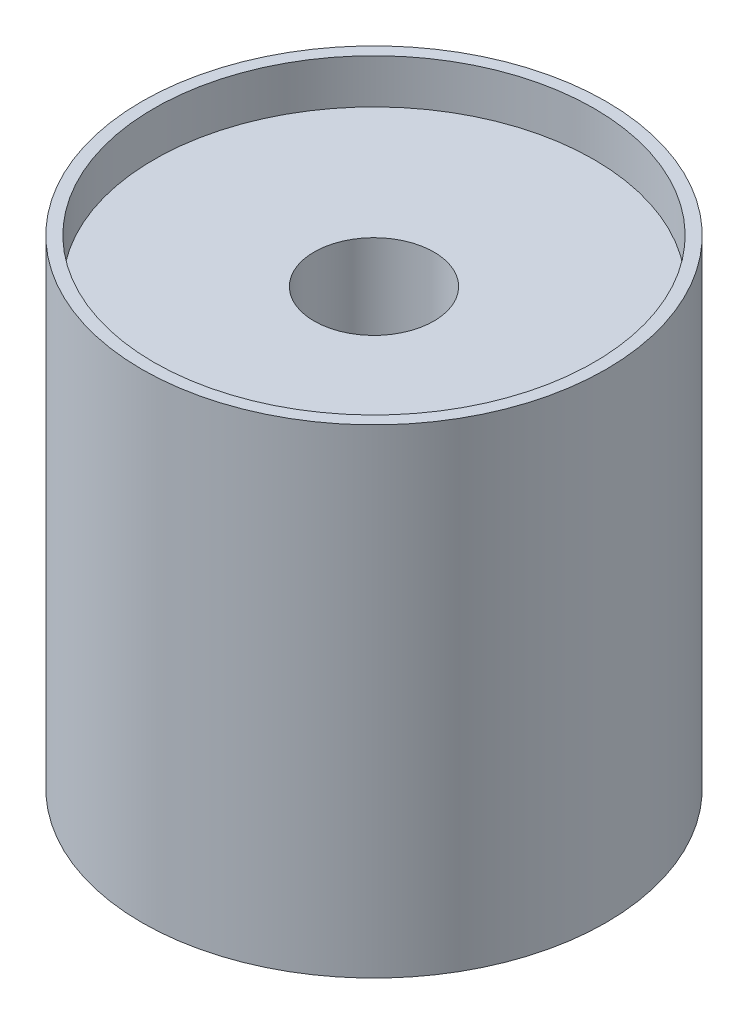
ISO-10303-21;
HEADER;
FILE_DESCRIPTION(('STEP AP214'),'2;1');
FILE_NAME('part.step','',(''),(''),'','','');
FILE_SCHEMA(('AUTOMOTIVE_DESIGN { 1 0 10303 214 1 1 1 1 }'));
ENDSEC;
DATA;
#1=APPLICATION_CONTEXT('core data for automotive mechanical design processes');
#2=APPLICATION_PROTOCOL_DEFINITION('international standard','automotive_design',2000,#1);
#3=PRODUCT_CONTEXT('',#1,'mechanical');
#4=PRODUCT('Part','Part','',(#3));
#5=PRODUCT_RELATED_PRODUCT_CATEGORY('part','',(#4));
#6=PRODUCT_DEFINITION_FORMATION('','',#4);
#7=PRODUCT_DEFINITION_CONTEXT('part definition',#1,'design');
#8=PRODUCT_DEFINITION('design','',#6,#7);
#9=PRODUCT_DEFINITION_SHAPE('','',#8);
#10=(LENGTH_UNIT() NAMED_UNIT(*) SI_UNIT(.MILLI.,.METRE.));
#11=(NAMED_UNIT(*) PLANE_ANGLE_UNIT() SI_UNIT($,.RADIAN.));
#12=(NAMED_UNIT(*) SI_UNIT($,.STERADIAN.) SOLID_ANGLE_UNIT());
#13=UNCERTAINTY_MEASURE_WITH_UNIT(LENGTH_MEASURE(1.E-05),#10,'distance_accuracy_value','');
#14=(GEOMETRIC_REPRESENTATION_CONTEXT(3) GLOBAL_UNCERTAINTY_ASSIGNED_CONTEXT((#13)) GLOBAL_UNIT_ASSIGNED_CONTEXT((#10,
#11,#12)) REPRESENTATION_CONTEXT('',''));
#15=CARTESIAN_POINT('',(0.,0.,0.));
#16=DIRECTION('',(0.,0.,1.));
#17=DIRECTION('',(1.,0.,0.));
#18=AXIS2_PLACEMENT_3D('',#15,#16,#17);
#19=CARTESIAN_POINT('',(0.,101.6,0.));
#20=DIRECTION('',(0.,-1.,0.));
#21=DIRECTION('',(0.,0.,-1.));
#22=AXIS2_PLACEMENT_3D('',#19,#20,#21);
#23=CYLINDRICAL_SURFACE('',#22,49.2125);
#24=CARTESIAN_POINT('',(0.,101.6,0.));
#25=DIRECTION('',(0.,1.,0.));
#26=DIRECTION('',(0.,0.,1.));
#27=AXIS2_PLACEMENT_3D('',#24,#25,#26);
#28=CIRCLE('',#27,49.2125);
#29=CARTESIAN_POINT('',(0.,101.6,49.2125));
#30=VERTEX_POINT('',#29);
#31=EDGE_CURVE('E10',#30,#30,#28,.T.);
#32=ORIENTED_EDGE('',*,*,#31,.F.);
#33=EDGE_LOOP('',(#32));
#34=FACE_BOUND('',#33,.T.);
#35=CARTESIAN_POINT('',(0.,0.,0.));
#36=DIRECTION('',(0.,1.,0.));
#37=DIRECTION('',(0.,0.,1.));
#38=AXIS2_PLACEMENT_3D('',#35,#36,#37);
#39=CIRCLE('',#38,49.2125);
#40=CARTESIAN_POINT('',(0.,0.,49.2125));
#41=VERTEX_POINT('',#40);
#42=EDGE_CURVE('E45',#41,#41,#39,.T.);
#43=ORIENTED_EDGE('',*,*,#42,.T.);
#44=EDGE_LOOP('',(#43));
#45=FACE_BOUND('',#44,.T.);
#46=ADVANCED_FACE('F37',(#34,#45),#23,.T.);
#47=CARTESIAN_POINT('',(0.,101.6,0.));
#48=DIRECTION('',(0.,1.,0.));
#49=DIRECTION('',(0.,0.,1.));
#50=AXIS2_PLACEMENT_3D('',#47,#48,#49);
#51=PLANE('',#50);
#52=CARTESIAN_POINT('',(0.,101.6,0.));
#53=DIRECTION('',(0.,1.,0.));
#54=DIRECTION('',(0.,0.,1.));
#55=AXIS2_PLACEMENT_3D('',#52,#53,#54);
#56=CIRCLE('',#55,46.6543074065738);
#57=CARTESIAN_POINT('',(0.,101.6,46.6543074065738));
#58=VERTEX_POINT('',#57);
#59=EDGE_CURVE('E56',#58,#58,#56,.T.);
#60=ORIENTED_EDGE('',*,*,#59,.F.);
#61=EDGE_LOOP('',(#60));
#62=FACE_BOUND('',#61,.T.);
#63=ORIENTED_EDGE('',*,*,#31,.T.);
#64=EDGE_LOOP('',(#63));
#65=FACE_BOUND('',#64,.T.);
#66=ADVANCED_FACE('F85',(#62,#65),#51,.T.);
#67=CARTESIAN_POINT('',(0.,0.,0.));
#68=DIRECTION('',(0.,1.,0.));
#69=DIRECTION('',(0.,0.,1.));
#70=AXIS2_PLACEMENT_3D('',#67,#68,#69);
#71=PLANE('',#70);
#72=ORIENTED_EDGE('',*,*,#42,.F.);
#73=EDGE_LOOP('',(#72));
#74=FACE_BOUND('',#73,.T.);
#75=ADVANCED_FACE('F90',(#74),#71,.F.);
#76=CARTESIAN_POINT('',(0.,92.202,0.));
#77=DIRECTION('',(0.,1.,0.));
#78=DIRECTION('',(0.,0.,1.));
#79=AXIS2_PLACEMENT_3D('',#76,#77,#78);
#80=PLANE('',#79);
#81=CARTESIAN_POINT('',(0.,92.202,0.));
#82=DIRECTION('',(0.,1.,0.));
#83=DIRECTION('',(0.,0.,1.));
#84=AXIS2_PLACEMENT_3D('',#81,#82,#83);
#85=CIRCLE('',#84,46.6543074065738);
#86=CARTESIAN_POINT('',(0.,92.202,46.6543074065738));
#87=VERTEX_POINT('',#86);
#88=EDGE_CURVE('E60',#87,#87,#85,.T.);
#89=ORIENTED_EDGE('',*,*,#88,.T.);
#90=EDGE_LOOP('',(#89));
#91=FACE_BOUND('',#90,.T.);
#92=CARTESIAN_POINT('',(0.,92.202,0.));
#93=DIRECTION('',(0.,1.,0.));
#94=DIRECTION('',(0.,0.,1.));
#95=AXIS2_PLACEMENT_3D('',#92,#93,#94);
#96=CIRCLE('',#95,12.7);
#97=CARTESIAN_POINT('',(0.,92.202,12.7));
#98=VERTEX_POINT('',#97);
#99=EDGE_CURVE('E40',#98,#98,#96,.F.);
#100=ORIENTED_EDGE('',*,*,#99,.T.);
#101=EDGE_LOOP('',(#100));
#102=FACE_BOUND('',#101,.T.);
#103=ADVANCED_FACE('F69',(#91,#102),#80,.T.);
#104=CARTESIAN_POINT('',(0.,92.202,0.));
#105=DIRECTION('',(0.,1.,0.));
#106=DIRECTION('',(0.,0.,1.));
#107=AXIS2_PLACEMENT_3D('',#104,#105,#106);
#108=CYLINDRICAL_SURFACE('',#107,46.6543074065738);
#109=ORIENTED_EDGE('',*,*,#88,.F.);
#110=EDGE_LOOP('',(#109));
#111=FACE_BOUND('',#110,.T.);
#112=ORIENTED_EDGE('',*,*,#59,.T.);
#113=EDGE_LOOP('',(#112));
#114=FACE_BOUND('',#113,.T.);
#115=ADVANCED_FACE('F79',(#111,#114),#108,.F.);
#116=CARTESIAN_POINT('',(0.,55.88,0.));
#117=DIRECTION('',(0.,1.,0.));
#118=DIRECTION('',(0.,0.,1.));
#119=AXIS2_PLACEMENT_3D('',#116,#117,#118);
#120=PLANE('',#119);
#121=CARTESIAN_POINT('',(0.,55.88,0.));
#122=DIRECTION('',(0.,1.,0.));
#123=DIRECTION('',(0.,0.,1.));
#124=AXIS2_PLACEMENT_3D('',#121,#122,#123);
#125=CIRCLE('',#124,12.7);
#126=CARTESIAN_POINT('',(0.,55.88,12.7));
#127=VERTEX_POINT('',#126);
#128=EDGE_CURVE('E51',#127,#127,#125,.T.);
#129=ORIENTED_EDGE('',*,*,#128,.T.);
#130=EDGE_LOOP('',(#129));
#131=FACE_BOUND('',#130,.T.);
#132=ADVANCED_FACE('F73',(#131),#120,.T.);
#133=CARTESIAN_POINT('',(0.,55.88,0.));
#134=DIRECTION('',(0.,1.,0.));
#135=DIRECTION('',(0.,0.,1.));
#136=AXIS2_PLACEMENT_3D('',#133,#134,#135);
#137=CYLINDRICAL_SURFACE('',#136,12.7);
#138=ORIENTED_EDGE('',*,*,#128,.F.);
#139=EDGE_LOOP('',(#138));
#140=FACE_BOUND('',#139,.T.);
#141=ORIENTED_EDGE('',*,*,#99,.F.);
#142=EDGE_LOOP('',(#141));
#143=FACE_BOUND('',#142,.T.);
#144=ADVANCED_FACE('F71',(#140,#143),#137,.F.);
#145=CLOSED_SHELL('',(#46,#66,#75,#103,#115,#132,#144));
#146=MANIFOLD_SOLID_BREP('B2',#145);
#147=ADVANCED_BREP_SHAPE_REPRESENTATION('',(#18,#146),#14);
#148=SHAPE_DEFINITION_REPRESENTATION(#9,#147);
ENDSEC;
END-ISO-10303-21;
